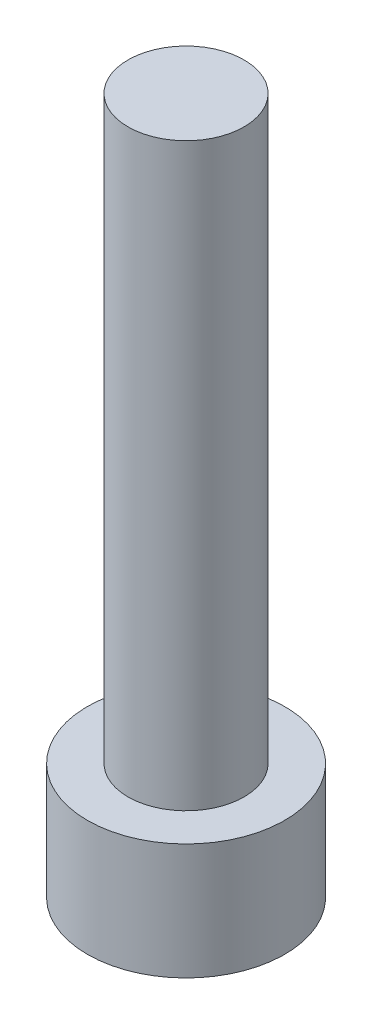
ISO-10303-21;
HEADER;
FILE_DESCRIPTION(('STEP AP214'),'2;1');
FILE_NAME('part.step','',(''),(''),'','','');
FILE_SCHEMA(('AUTOMOTIVE_DESIGN { 1 0 10303 214 1 1 1 1 }'));
ENDSEC;
DATA;
#1=APPLICATION_CONTEXT('core data for automotive mechanical design processes');
#2=APPLICATION_PROTOCOL_DEFINITION('international standard','automotive_design',2000,#1);
#3=PRODUCT_CONTEXT('',#1,'mechanical');
#4=PRODUCT('Part','Part','',(#3));
#5=PRODUCT_RELATED_PRODUCT_CATEGORY('part','',(#4));
#6=PRODUCT_DEFINITION_FORMATION('','',#4);
#7=PRODUCT_DEFINITION_CONTEXT('part definition',#1,'design');
#8=PRODUCT_DEFINITION('design','',#6,#7);
#9=PRODUCT_DEFINITION_SHAPE('','',#8);
#10=(LENGTH_UNIT() NAMED_UNIT(*) SI_UNIT(.MILLI.,.METRE.));
#11=(NAMED_UNIT(*) PLANE_ANGLE_UNIT() SI_UNIT($,.RADIAN.));
#12=(NAMED_UNIT(*) SI_UNIT($,.STERADIAN.) SOLID_ANGLE_UNIT());
#13=UNCERTAINTY_MEASURE_WITH_UNIT(LENGTH_MEASURE(1.E-05),#10,'distance_accuracy_value','');
#14=(GEOMETRIC_REPRESENTATION_CONTEXT(3) GLOBAL_UNCERTAINTY_ASSIGNED_CONTEXT((#13)) GLOBAL_UNIT_ASSIGNED_CONTEXT((#10,
#11,#12)) REPRESENTATION_CONTEXT('',''));
#15=CARTESIAN_POINT('',(0.,0.,0.));
#16=DIRECTION('',(0.,0.,1.));
#17=DIRECTION('',(1.,0.,0.));
#18=AXIS2_PLACEMENT_3D('',#15,#16,#17);
#19=CARTESIAN_POINT('',(0.,6.,0.));
#20=DIRECTION('',(0.,-1.,0.));
#21=DIRECTION('',(0.,0.,-1.));
#22=AXIS2_PLACEMENT_3D('',#19,#20,#21);
#23=CYLINDRICAL_SURFACE('',#22,5.1);
#24=CARTESIAN_POINT('',(0.,6.,0.));
#25=DIRECTION('',(0.,1.,0.));
#26=DIRECTION('',(0.,0.,1.));
#27=AXIS2_PLACEMENT_3D('',#24,#25,#26);
#28=CIRCLE('',#27,5.1);
#29=CARTESIAN_POINT('',(0.,6.,5.1));
#30=VERTEX_POINT('',#29);
#31=EDGE_CURVE('E45',#30,#30,#28,.T.);
#32=ORIENTED_EDGE('',*,*,#31,.F.);
#33=EDGE_LOOP('',(#32));
#34=FACE_BOUND('',#33,.T.);
#35=CARTESIAN_POINT('',(0.,0.,0.));
#36=DIRECTION('',(0.,1.,0.));
#37=DIRECTION('',(0.,0.,1.));
#38=AXIS2_PLACEMENT_3D('',#35,#36,#37);
#39=CIRCLE('',#38,5.1);
#40=CARTESIAN_POINT('',(0.,0.,5.1));
#41=VERTEX_POINT('',#40);
#42=EDGE_CURVE('E40',#41,#41,#39,.T.);
#43=ORIENTED_EDGE('',*,*,#42,.T.);
#44=EDGE_LOOP('',(#43));
#45=FACE_BOUND('',#44,.T.);
#46=ADVANCED_FACE('F37',(#34,#45),#23,.T.);
#47=CARTESIAN_POINT('',(0.,6.,0.));
#48=DIRECTION('',(0.,1.,0.));
#49=DIRECTION('',(0.,0.,1.));
#50=AXIS2_PLACEMENT_3D('',#47,#48,#49);
#51=PLANE('',#50);
#52=CARTESIAN_POINT('',(0.,6.,0.));
#53=DIRECTION('',(0.,1.,0.));
#54=DIRECTION('',(0.,0.,1.));
#55=AXIS2_PLACEMENT_3D('',#52,#53,#54);
#56=CIRCLE('',#55,3.);
#57=CARTESIAN_POINT('',(0.,6.,3.));
#58=VERTEX_POINT('',#57);
#59=EDGE_CURVE('E10',#58,#58,#56,.T.);
#60=ORIENTED_EDGE('',*,*,#59,.F.);
#61=EDGE_LOOP('',(#60));
#62=FACE_BOUND('',#61,.T.);
#63=ORIENTED_EDGE('',*,*,#31,.T.);
#64=EDGE_LOOP('',(#63));
#65=FACE_BOUND('',#64,.T.);
#66=ADVANCED_FACE('F65',(#62,#65),#51,.T.);
#67=CARTESIAN_POINT('',(0.,0.,0.));
#68=DIRECTION('',(0.,1.,0.));
#69=DIRECTION('',(0.,0.,1.));
#70=AXIS2_PLACEMENT_3D('',#67,#68,#69);
#71=PLANE('',#70);
#72=ORIENTED_EDGE('',*,*,#42,.F.);
#73=EDGE_LOOP('',(#72));
#74=FACE_BOUND('',#73,.T.);
#75=ADVANCED_FACE('F62',(#74),#71,.F.);
#76=CARTESIAN_POINT('',(0.,36.,0.));
#77=DIRECTION('',(0.,-1.,0.));
#78=DIRECTION('',(0.,0.,-1.));
#79=AXIS2_PLACEMENT_3D('',#76,#77,#78);
#80=CYLINDRICAL_SURFACE('',#79,3.);
#81=CARTESIAN_POINT('',(0.,36.,0.));
#82=DIRECTION('',(0.,1.,0.));
#83=DIRECTION('',(0.,0.,1.));
#84=AXIS2_PLACEMENT_3D('',#81,#82,#83);
#85=CIRCLE('',#84,3.);
#86=CARTESIAN_POINT('',(0.,36.,3.));
#87=VERTEX_POINT('',#86);
#88=EDGE_CURVE('E52',#87,#87,#85,.T.);
#89=ORIENTED_EDGE('',*,*,#88,.F.);
#90=EDGE_LOOP('',(#89));
#91=FACE_BOUND('',#90,.T.);
#92=ORIENTED_EDGE('',*,*,#59,.T.);
#93=EDGE_LOOP('',(#92));
#94=FACE_BOUND('',#93,.T.);
#95=ADVANCED_FACE('F64',(#91,#94),#80,.T.);
#96=CARTESIAN_POINT('',(0.,36.,0.));
#97=DIRECTION('',(0.,1.,0.));
#98=DIRECTION('',(0.,0.,1.));
#99=AXIS2_PLACEMENT_3D('',#96,#97,#98);
#100=PLANE('',#99);
#101=ORIENTED_EDGE('',*,*,#88,.T.);
#102=EDGE_LOOP('',(#101));
#103=FACE_BOUND('',#102,.T.);
#104=ADVANCED_FACE('F70',(#103),#100,.T.);
#105=CLOSED_SHELL('',(#46,#66,#75,#95,#104));
#106=MANIFOLD_SOLID_BREP('B2',#105);
#107=ADVANCED_BREP_SHAPE_REPRESENTATION('',(#18,#106),#14);
#108=SHAPE_DEFINITION_REPRESENTATION(#9,#107);
ENDSEC;
END-ISO-10303-21;
